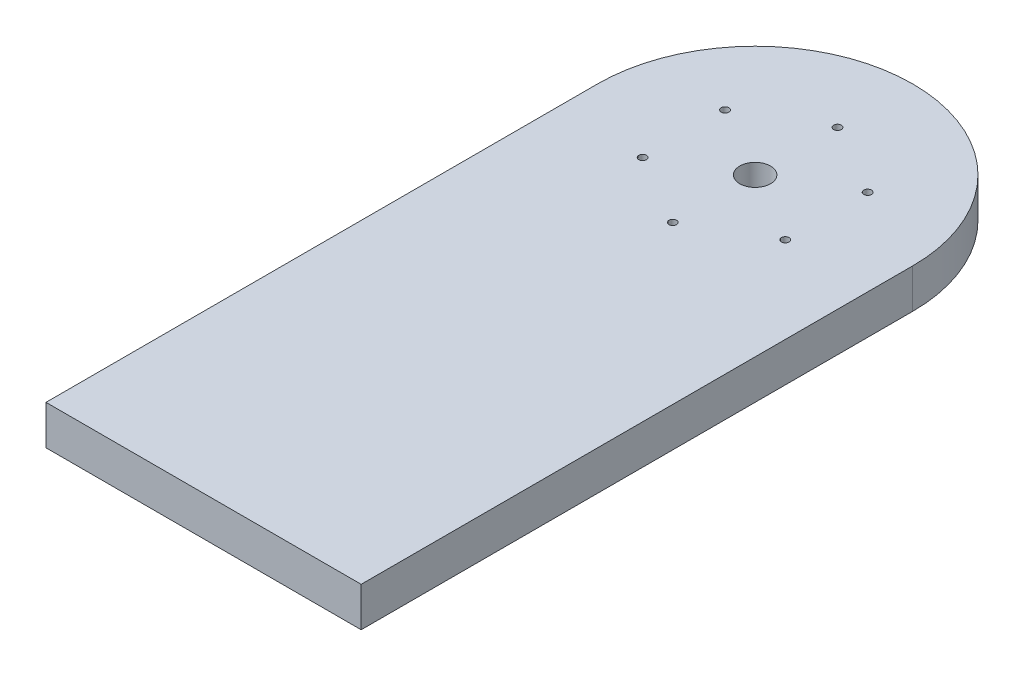
ISO-10303-21;
HEADER;
FILE_DESCRIPTION(('STEP AP214'),'2;1');
FILE_NAME('part.step','',(''),(''),'','','');
FILE_SCHEMA(('AUTOMOTIVE_DESIGN { 1 0 10303 214 1 1 1 1 }'));
ENDSEC;
DATA;
#1=APPLICATION_CONTEXT('core data for automotive mechanical design processes');
#2=APPLICATION_PROTOCOL_DEFINITION('international standard','automotive_design',2000,#1);
#3=PRODUCT_CONTEXT('',#1,'mechanical');
#4=PRODUCT('Part','Part','',(#3));
#5=PRODUCT_RELATED_PRODUCT_CATEGORY('part','',(#4));
#6=PRODUCT_DEFINITION_FORMATION('','',#4);
#7=PRODUCT_DEFINITION_CONTEXT('part definition',#1,'design');
#8=PRODUCT_DEFINITION('design','',#6,#7);
#9=PRODUCT_DEFINITION_SHAPE('','',#8);
#10=(LENGTH_UNIT() NAMED_UNIT(*) SI_UNIT(.MILLI.,.METRE.));
#11=(NAMED_UNIT(*) PLANE_ANGLE_UNIT() SI_UNIT($,.RADIAN.));
#12=(NAMED_UNIT(*) SI_UNIT($,.STERADIAN.) SOLID_ANGLE_UNIT());
#13=UNCERTAINTY_MEASURE_WITH_UNIT(LENGTH_MEASURE(1.E-05),#10,'distance_accuracy_value','');
#14=(GEOMETRIC_REPRESENTATION_CONTEXT(3) GLOBAL_UNCERTAINTY_ASSIGNED_CONTEXT((#13)) GLOBAL_UNIT_ASSIGNED_CONTEXT((#10,
#11,#12)) REPRESENTATION_CONTEXT('',''));
#15=CARTESIAN_POINT('',(0.,0.,0.));
#16=DIRECTION('',(0.,0.,1.));
#17=DIRECTION('',(1.,0.,0.));
#18=AXIS2_PLACEMENT_3D('',#15,#16,#17);
#19=CARTESIAN_POINT('',(0.,6.35,0.));
#20=DIRECTION('',(0.,-1.,0.));
#21=DIRECTION('',(0.,0.,-1.));
#22=AXIS2_PLACEMENT_3D('',#19,#20,#21);
#23=CYLINDRICAL_SURFACE('',#22,25.4);
#24=CARTESIAN_POINT('',(0.,0.,0.));
#25=DIRECTION('',(0.,1.,0.));
#26=DIRECTION('',(0.,0.,1.));
#27=AXIS2_PLACEMENT_3D('',#24,#25,#26);
#28=CIRCLE('',#27,25.4);
#29=CARTESIAN_POINT('',(25.4,0.,0.));
#30=VERTEX_POINT('',#29);
#31=CARTESIAN_POINT('',(-25.4,0.,0.));
#32=VERTEX_POINT('',#31);
#33=EDGE_CURVE('E95',#30,#32,#28,.T.);
#34=ORIENTED_EDGE('',*,*,#33,.T.);
#35=DIRECTION('',(0.,-1.,0.));
#36=VECTOR('',#35,1.);
#37=CARTESIAN_POINT('',(-25.4,6.35,0.));
#38=LINE('',#37,#36);
#39=CARTESIAN_POINT('',(-25.4,6.35,0.));
#40=VERTEX_POINT('',#39);
#41=EDGE_CURVE('E11',#40,#32,#38,.T.);
#42=ORIENTED_EDGE('',*,*,#41,.F.);
#43=CARTESIAN_POINT('',(0.,6.35,0.));
#44=DIRECTION('',(0.,1.,0.));
#45=DIRECTION('',(0.,0.,1.));
#46=AXIS2_PLACEMENT_3D('',#43,#44,#45);
#47=CIRCLE('',#46,25.4);
#48=CARTESIAN_POINT('',(25.4,6.35,0.));
#49=VERTEX_POINT('',#48);
#50=EDGE_CURVE('E83',#49,#40,#47,.T.);
#51=ORIENTED_EDGE('',*,*,#50,.F.);
#52=DIRECTION('',(0.,-1.,0.));
#53=VECTOR('',#52,1.);
#54=CARTESIAN_POINT('',(25.4,6.35,0.));
#55=LINE('',#54,#53);
#56=EDGE_CURVE('E91',#49,#30,#55,.T.);
#57=ORIENTED_EDGE('',*,*,#56,.T.);
#58=EDGE_LOOP('',(#34,#42,#51,#57));
#59=FACE_BOUND('',#58,.T.);
#60=ADVANCED_FACE('F32',(#59),#23,.T.);
#61=CARTESIAN_POINT('',(-25.4,6.35,0.));
#62=DIRECTION('',(1.,0.,0.));
#63=DIRECTION('',(0.,0.,-1.));
#64=AXIS2_PLACEMENT_3D('',#61,#62,#63);
#65=PLANE('',#64);
#66=DIRECTION('',(0.,0.,1.));
#67=VECTOR('',#66,1.);
#68=CARTESIAN_POINT('',(-25.4,0.,0.));
#69=LINE('',#68,#67);
#70=CARTESIAN_POINT('',(-25.4,0.,88.9));
#71=VERTEX_POINT('',#70);
#72=EDGE_CURVE('E87',#32,#71,#69,.T.);
#73=ORIENTED_EDGE('',*,*,#72,.T.);
#74=DIRECTION('',(0.,-1.,0.));
#75=VECTOR('',#74,1.);
#76=CARTESIAN_POINT('',(-25.4,6.35,88.9));
#77=LINE('',#76,#75);
#78=CARTESIAN_POINT('',(-25.4,6.35,88.9));
#79=VERTEX_POINT('',#78);
#80=EDGE_CURVE('E40',#79,#71,#77,.T.);
#81=ORIENTED_EDGE('',*,*,#80,.F.);
#82=DIRECTION('',(0.,0.,1.));
#83=VECTOR('',#82,1.);
#84=CARTESIAN_POINT('',(-25.4,6.35,0.));
#85=LINE('',#84,#83);
#86=EDGE_CURVE('E78',#40,#79,#85,.T.);
#87=ORIENTED_EDGE('',*,*,#86,.F.);
#88=ORIENTED_EDGE('',*,*,#41,.T.);
#89=EDGE_LOOP('',(#73,#81,#87,#88));
#90=FACE_BOUND('',#89,.T.);
#91=ADVANCED_FACE('F86',(#90),#65,.F.);
#92=CARTESIAN_POINT('',(-25.4,6.35,88.9));
#93=DIRECTION('',(0.,0.,-1.));
#94=DIRECTION('',(-1.,0.,0.));
#95=AXIS2_PLACEMENT_3D('',#92,#93,#94);
#96=PLANE('',#95);
#97=DIRECTION('',(1.,0.,0.));
#98=VECTOR('',#97,1.);
#99=CARTESIAN_POINT('',(-25.4,0.,88.9));
#100=LINE('',#99,#98);
#101=CARTESIAN_POINT('',(25.4,0.,88.9));
#102=VERTEX_POINT('',#101);
#103=EDGE_CURVE('E65',#71,#102,#100,.T.);
#104=ORIENTED_EDGE('',*,*,#103,.T.);
#105=DIRECTION('',(0.,-1.,0.));
#106=VECTOR('',#105,1.);
#107=CARTESIAN_POINT('',(25.4,6.35,88.9));
#108=LINE('',#107,#106);
#109=CARTESIAN_POINT('',(25.4,6.35,88.9));
#110=VERTEX_POINT('',#109);
#111=EDGE_CURVE('E88',#110,#102,#108,.T.);
#112=ORIENTED_EDGE('',*,*,#111,.F.);
#113=DIRECTION('',(1.,0.,0.));
#114=VECTOR('',#113,1.);
#115=CARTESIAN_POINT('',(-25.4,6.35,88.9));
#116=LINE('',#115,#114);
#117=EDGE_CURVE('E81',#79,#110,#116,.T.);
#118=ORIENTED_EDGE('',*,*,#117,.F.);
#119=ORIENTED_EDGE('',*,*,#80,.T.);
#120=EDGE_LOOP('',(#104,#112,#118,#119));
#121=FACE_BOUND('',#120,.T.);
#122=ADVANCED_FACE('F89',(#121),#96,.F.);
#123=CARTESIAN_POINT('',(25.4,6.35,0.));
#124=DIRECTION('',(-1.,0.,0.));
#125=DIRECTION('',(0.,0.,1.));
#126=AXIS2_PLACEMENT_3D('',#123,#124,#125);
#127=PLANE('',#126);
#128=DIRECTION('',(0.,0.,-1.));
#129=VECTOR('',#128,1.);
#130=CARTESIAN_POINT('',(25.4,0.,0.));
#131=LINE('',#130,#129);
#132=EDGE_CURVE('E71',#102,#30,#131,.T.);
#133=ORIENTED_EDGE('',*,*,#132,.T.);
#134=ORIENTED_EDGE('',*,*,#56,.F.);
#135=DIRECTION('',(0.,0.,-1.));
#136=VECTOR('',#135,1.);
#137=CARTESIAN_POINT('',(25.4,6.35,0.));
#138=LINE('',#137,#136);
#139=EDGE_CURVE('E48',#110,#49,#138,.T.);
#140=ORIENTED_EDGE('',*,*,#139,.F.);
#141=ORIENTED_EDGE('',*,*,#111,.T.);
#142=EDGE_LOOP('',(#133,#134,#140,#141));
#143=FACE_BOUND('',#142,.T.);
#144=ADVANCED_FACE('F103',(#143),#127,.F.);
#145=CARTESIAN_POINT('',(0.,6.35,0.));
#146=DIRECTION('',(0.,1.,0.));
#147=DIRECTION('',(0.,0.,1.));
#148=AXIS2_PLACEMENT_3D('',#145,#146,#147);
#149=PLANE('',#148);
#150=CARTESIAN_POINT('',(0.,6.35,0.));
#151=DIRECTION('',(0.,1.,0.));
#152=DIRECTION('',(0.,0.,1.));
#153=AXIS2_PLACEMENT_3D('',#150,#151,#152);
#154=CIRCLE('',#153,2.4801000055);
#155=CARTESIAN_POINT('',(0.,6.35,2.4801000055));
#156=VERTEX_POINT('',#155);
#157=EDGE_CURVE('E145',#156,#156,#154,.T.);
#158=ORIENTED_EDGE('',*,*,#157,.F.);
#159=EDGE_LOOP('',(#158));
#160=FACE_BOUND('',#159,.T.);
#161=CARTESIAN_POINT('',(11.4930231344893,6.35,6.63550000050003));
#162=DIRECTION('',(0.,1.,0.));
#163=DIRECTION('',(0.,0.,1.));
#164=AXIS2_PLACEMENT_3D('',#161,#162,#163);
#165=CIRCLE('',#164,0.620000030000047);
#166=CARTESIAN_POINT('',(11.4930231344893,6.35,7.25550003050007));
#167=VERTEX_POINT('',#166);
#168=EDGE_CURVE('E139',#167,#167,#165,.T.);
#169=ORIENTED_EDGE('',*,*,#168,.F.);
#170=EDGE_LOOP('',(#169));
#171=FACE_BOUND('',#170,.T.);
#172=CARTESIAN_POINT('',(11.4930231344893,6.35,-6.63550000050006));
#173=DIRECTION('',(0.,1.,0.));
#174=DIRECTION('',(0.,0.,1.));
#175=AXIS2_PLACEMENT_3D('',#172,#173,#174);
#176=CIRCLE('',#175,0.620000030000002);
#177=CARTESIAN_POINT('',(11.4930231344893,6.35,-6.01549997050006));
#178=VERTEX_POINT('',#177);
#179=EDGE_CURVE('E133',#178,#178,#176,.T.);
#180=ORIENTED_EDGE('',*,*,#179,.F.);
#181=EDGE_LOOP('',(#180));
#182=FACE_BOUND('',#181,.T.);
#183=CARTESIAN_POINT('',(-11.4930231344893,6.35,6.63550000050006));
#184=DIRECTION('',(0.,1.,0.));
#185=DIRECTION('',(0.,0.,1.));
#186=AXIS2_PLACEMENT_3D('',#183,#184,#185);
#187=CIRCLE('',#186,0.620000029999999);
#188=CARTESIAN_POINT('',(-11.4930231344893,6.35,7.25550003050006));
#189=VERTEX_POINT('',#188);
#190=EDGE_CURVE('E127',#189,#189,#187,.T.);
#191=ORIENTED_EDGE('',*,*,#190,.F.);
#192=EDGE_LOOP('',(#191));
#193=FACE_BOUND('',#192,.T.);
#194=CARTESIAN_POINT('',(-11.4930231344893,6.35,-6.63550000050002));
#195=DIRECTION('',(0.,1.,0.));
#196=DIRECTION('',(0.,0.,1.));
#197=AXIS2_PLACEMENT_3D('',#194,#195,#196);
#198=CIRCLE('',#197,0.620000029999954);
#199=CARTESIAN_POINT('',(-11.4930231344893,6.35,-6.01549997050007));
#200=VERTEX_POINT('',#199);
#201=EDGE_CURVE('E121',#200,#200,#198,.T.);
#202=ORIENTED_EDGE('',*,*,#201,.F.);
#203=EDGE_LOOP('',(#202));
#204=FACE_BOUND('',#203,.T.);
#205=CARTESIAN_POINT('',(0.,6.35,13.271000001));
#206=DIRECTION('',(0.,1.,0.));
#207=DIRECTION('',(0.,0.,1.));
#208=AXIS2_PLACEMENT_3D('',#205,#206,#207);
#209=CIRCLE('',#208,0.62000003);
#210=CARTESIAN_POINT('',(0.,6.35,13.891000031));
#211=VERTEX_POINT('',#210);
#212=EDGE_CURVE('E115',#211,#211,#209,.T.);
#213=ORIENTED_EDGE('',*,*,#212,.F.);
#214=EDGE_LOOP('',(#213));
#215=FACE_BOUND('',#214,.T.);
#216=CARTESIAN_POINT('',(0.,6.35,-13.271000001));
#217=DIRECTION('',(0.,1.,0.));
#218=DIRECTION('',(0.,0.,1.));
#219=AXIS2_PLACEMENT_3D('',#216,#217,#218);
#220=CIRCLE('',#219,0.620000029999999);
#221=CARTESIAN_POINT('',(0.,6.35,-12.650999971));
#222=VERTEX_POINT('',#221);
#223=EDGE_CURVE('E109',#222,#222,#220,.T.);
#224=ORIENTED_EDGE('',*,*,#223,.F.);
#225=EDGE_LOOP('',(#224));
#226=FACE_BOUND('',#225,.T.);
#227=ORIENTED_EDGE('',*,*,#50,.T.);
#228=ORIENTED_EDGE('',*,*,#86,.T.);
#229=ORIENTED_EDGE('',*,*,#117,.T.);
#230=ORIENTED_EDGE('',*,*,#139,.T.);
#231=EDGE_LOOP('',(#227,#228,#229,#230));
#232=FACE_BOUND('',#231,.T.);
#233=ADVANCED_FACE('F79',(#160,#171,#182,#193,#204,#215,#226,#232),#149,.T.);
#234=CARTESIAN_POINT('',(0.,0.,0.));
#235=DIRECTION('',(0.,1.,0.));
#236=DIRECTION('',(0.,0.,1.));
#237=AXIS2_PLACEMENT_3D('',#234,#235,#236);
#238=PLANE('',#237);
#239=CARTESIAN_POINT('',(0.,0.,0.));
#240=DIRECTION('',(0.,1.,0.));
#241=DIRECTION('',(0.,0.,1.));
#242=AXIS2_PLACEMENT_3D('',#239,#240,#241);
#243=CIRCLE('',#242,2.4801000055);
#244=CARTESIAN_POINT('',(0.,0.,2.4801000055));
#245=VERTEX_POINT('',#244);
#246=EDGE_CURVE('E142',#245,#245,#243,.T.);
#247=ORIENTED_EDGE('',*,*,#246,.T.);
#248=EDGE_LOOP('',(#247));
#249=FACE_BOUND('',#248,.T.);
#250=CARTESIAN_POINT('',(11.4930231344893,0.,6.63550000050003));
#251=DIRECTION('',(0.,1.,0.));
#252=DIRECTION('',(0.,0.,1.));
#253=AXIS2_PLACEMENT_3D('',#250,#251,#252);
#254=CIRCLE('',#253,0.620000030000047);
#255=CARTESIAN_POINT('',(11.4930231344893,0.,7.25550003050007));
#256=VERTEX_POINT('',#255);
#257=EDGE_CURVE('E136',#256,#256,#254,.T.);
#258=ORIENTED_EDGE('',*,*,#257,.T.);
#259=EDGE_LOOP('',(#258));
#260=FACE_BOUND('',#259,.T.);
#261=CARTESIAN_POINT('',(11.4930231344893,0.,-6.63550000050006));
#262=DIRECTION('',(0.,1.,0.));
#263=DIRECTION('',(0.,0.,1.));
#264=AXIS2_PLACEMENT_3D('',#261,#262,#263);
#265=CIRCLE('',#264,0.620000030000002);
#266=CARTESIAN_POINT('',(11.4930231344893,0.,-6.01549997050006));
#267=VERTEX_POINT('',#266);
#268=EDGE_CURVE('E130',#267,#267,#265,.T.);
#269=ORIENTED_EDGE('',*,*,#268,.T.);
#270=EDGE_LOOP('',(#269));
#271=FACE_BOUND('',#270,.T.);
#272=CARTESIAN_POINT('',(-11.4930231344893,0.,6.63550000050006));
#273=DIRECTION('',(0.,1.,0.));
#274=DIRECTION('',(0.,0.,1.));
#275=AXIS2_PLACEMENT_3D('',#272,#273,#274);
#276=CIRCLE('',#275,0.620000029999999);
#277=CARTESIAN_POINT('',(-11.4930231344893,0.,7.25550003050006));
#278=VERTEX_POINT('',#277);
#279=EDGE_CURVE('E124',#278,#278,#276,.T.);
#280=ORIENTED_EDGE('',*,*,#279,.T.);
#281=EDGE_LOOP('',(#280));
#282=FACE_BOUND('',#281,.T.);
#283=CARTESIAN_POINT('',(-11.4930231344893,0.,-6.63550000050002));
#284=DIRECTION('',(0.,1.,0.));
#285=DIRECTION('',(0.,0.,1.));
#286=AXIS2_PLACEMENT_3D('',#283,#284,#285);
#287=CIRCLE('',#286,0.620000029999954);
#288=CARTESIAN_POINT('',(-11.4930231344893,0.,-6.01549997050007));
#289=VERTEX_POINT('',#288);
#290=EDGE_CURVE('E118',#289,#289,#287,.T.);
#291=ORIENTED_EDGE('',*,*,#290,.T.);
#292=EDGE_LOOP('',(#291));
#293=FACE_BOUND('',#292,.T.);
#294=CARTESIAN_POINT('',(0.,0.,13.271000001));
#295=DIRECTION('',(0.,1.,0.));
#296=DIRECTION('',(0.,0.,1.));
#297=AXIS2_PLACEMENT_3D('',#294,#295,#296);
#298=CIRCLE('',#297,0.62000003);
#299=CARTESIAN_POINT('',(0.,0.,13.891000031));
#300=VERTEX_POINT('',#299);
#301=EDGE_CURVE('E112',#300,#300,#298,.T.);
#302=ORIENTED_EDGE('',*,*,#301,.T.);
#303=EDGE_LOOP('',(#302));
#304=FACE_BOUND('',#303,.T.);
#305=CARTESIAN_POINT('',(0.,0.,-13.271000001));
#306=DIRECTION('',(0.,1.,0.));
#307=DIRECTION('',(0.,0.,1.));
#308=AXIS2_PLACEMENT_3D('',#305,#306,#307);
#309=CIRCLE('',#308,0.620000029999999);
#310=CARTESIAN_POINT('',(0.,0.,-12.650999971));
#311=VERTEX_POINT('',#310);
#312=EDGE_CURVE('E98',#311,#311,#309,.T.);
#313=ORIENTED_EDGE('',*,*,#312,.T.);
#314=EDGE_LOOP('',(#313));
#315=FACE_BOUND('',#314,.T.);
#316=ORIENTED_EDGE('',*,*,#33,.F.);
#317=ORIENTED_EDGE('',*,*,#132,.F.);
#318=ORIENTED_EDGE('',*,*,#103,.F.);
#319=ORIENTED_EDGE('',*,*,#72,.F.);
#320=EDGE_LOOP('',(#316,#317,#318,#319));
#321=FACE_BOUND('',#320,.T.);
#322=ADVANCED_FACE('F106',(#249,#260,#271,#282,#293,#304,#315,#321),#238,.F.);
#323=CARTESIAN_POINT('',(0.,0.,-13.271000001));
#324=DIRECTION('',(0.,1.,0.));
#325=DIRECTION('',(0.,0.,1.));
#326=AXIS2_PLACEMENT_3D('',#323,#324,#325);
#327=CYLINDRICAL_SURFACE('',#326,0.620000029999999);
#328=ORIENTED_EDGE('',*,*,#312,.F.);
#329=EDGE_LOOP('',(#328));
#330=FACE_BOUND('',#329,.T.);
#331=ORIENTED_EDGE('',*,*,#223,.T.);
#332=EDGE_LOOP('',(#331));
#333=FACE_BOUND('',#332,.T.);
#334=ADVANCED_FACE('F175',(#330,#333),#327,.F.);
#335=CARTESIAN_POINT('',(0.,0.,13.271000001));
#336=DIRECTION('',(0.,1.,0.));
#337=DIRECTION('',(0.,0.,1.));
#338=AXIS2_PLACEMENT_3D('',#335,#336,#337);
#339=CYLINDRICAL_SURFACE('',#338,0.62000003);
#340=ORIENTED_EDGE('',*,*,#301,.F.);
#341=EDGE_LOOP('',(#340));
#342=FACE_BOUND('',#341,.T.);
#343=ORIENTED_EDGE('',*,*,#212,.T.);
#344=EDGE_LOOP('',(#343));
#345=FACE_BOUND('',#344,.T.);
#346=ADVANCED_FACE('F177',(#342,#345),#339,.F.);
#347=CARTESIAN_POINT('',(-11.4930231344893,0.,-6.63550000050002));
#348=DIRECTION('',(0.,1.,0.));
#349=DIRECTION('',(0.,0.,1.));
#350=AXIS2_PLACEMENT_3D('',#347,#348,#349);
#351=CYLINDRICAL_SURFACE('',#350,0.620000029999954);
#352=ORIENTED_EDGE('',*,*,#290,.F.);
#353=EDGE_LOOP('',(#352));
#354=FACE_BOUND('',#353,.T.);
#355=ORIENTED_EDGE('',*,*,#201,.T.);
#356=EDGE_LOOP('',(#355));
#357=FACE_BOUND('',#356,.T.);
#358=ADVANCED_FACE('F184',(#354,#357),#351,.F.);
#359=CARTESIAN_POINT('',(-11.4930231344893,0.,6.63550000050006));
#360=DIRECTION('',(0.,1.,0.));
#361=DIRECTION('',(0.,0.,1.));
#362=AXIS2_PLACEMENT_3D('',#359,#360,#361);
#363=CYLINDRICAL_SURFACE('',#362,0.620000029999999);
#364=ORIENTED_EDGE('',*,*,#279,.F.);
#365=EDGE_LOOP('',(#364));
#366=FACE_BOUND('',#365,.T.);
#367=ORIENTED_EDGE('',*,*,#190,.T.);
#368=EDGE_LOOP('',(#367));
#369=FACE_BOUND('',#368,.T.);
#370=ADVANCED_FACE('F234',(#366,#369),#363,.F.);
#371=CARTESIAN_POINT('',(11.4930231344893,0.,-6.63550000050006));
#372=DIRECTION('',(0.,1.,0.));
#373=DIRECTION('',(0.,0.,1.));
#374=AXIS2_PLACEMENT_3D('',#371,#372,#373);
#375=CYLINDRICAL_SURFACE('',#374,0.620000030000002);
#376=ORIENTED_EDGE('',*,*,#268,.F.);
#377=EDGE_LOOP('',(#376));
#378=FACE_BOUND('',#377,.T.);
#379=ORIENTED_EDGE('',*,*,#179,.T.);
#380=EDGE_LOOP('',(#379));
#381=FACE_BOUND('',#380,.T.);
#382=ADVANCED_FACE('F227',(#378,#381),#375,.F.);
#383=CARTESIAN_POINT('',(11.4930231344893,0.,6.63550000050003));
#384=DIRECTION('',(0.,1.,0.));
#385=DIRECTION('',(0.,0.,1.));
#386=AXIS2_PLACEMENT_3D('',#383,#384,#385);
#387=CYLINDRICAL_SURFACE('',#386,0.620000030000047);
#388=ORIENTED_EDGE('',*,*,#257,.F.);
#389=EDGE_LOOP('',(#388));
#390=FACE_BOUND('',#389,.T.);
#391=ORIENTED_EDGE('',*,*,#168,.T.);
#392=EDGE_LOOP('',(#391));
#393=FACE_BOUND('',#392,.T.);
#394=ADVANCED_FACE('F156',(#390,#393),#387,.F.);
#395=CARTESIAN_POINT('',(0.,0.,0.));
#396=DIRECTION('',(0.,1.,0.));
#397=DIRECTION('',(0.,0.,1.));
#398=AXIS2_PLACEMENT_3D('',#395,#396,#397);
#399=CYLINDRICAL_SURFACE('',#398,2.4801000055);
#400=ORIENTED_EDGE('',*,*,#246,.F.);
#401=EDGE_LOOP('',(#400));
#402=FACE_BOUND('',#401,.T.);
#403=ORIENTED_EDGE('',*,*,#157,.T.);
#404=EDGE_LOOP('',(#403));
#405=FACE_BOUND('',#404,.T.);
#406=ADVANCED_FACE('F153',(#402,#405),#399,.F.);
#407=CLOSED_SHELL('',(#60,#91,#122,#144,#233,#322,#334,#346,#358,#370,#382,#394,#406));
#408=MANIFOLD_SOLID_BREP('B2',#407);
#409=ADVANCED_BREP_SHAPE_REPRESENTATION('',(#18,#408),#14);
#410=SHAPE_DEFINITION_REPRESENTATION(#9,#409);
ENDSEC;
END-ISO-10303-21;
